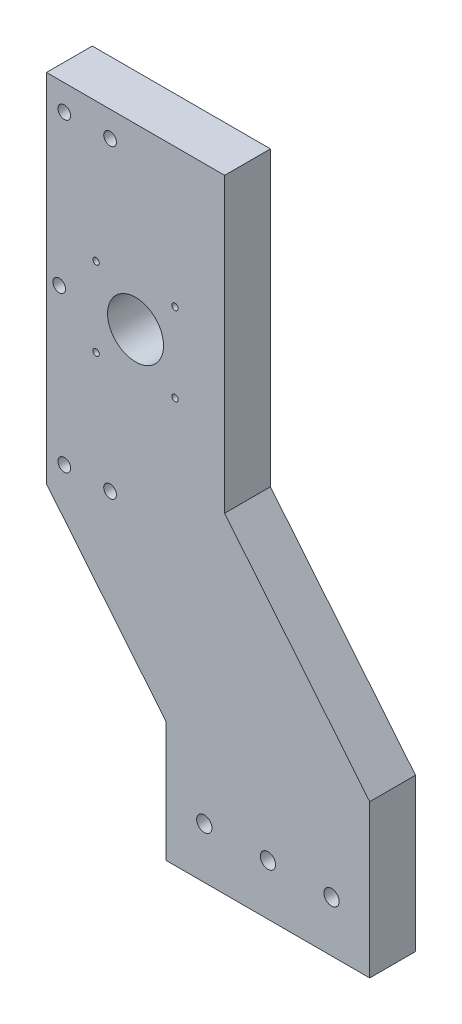
ISO-10303-21;
HEADER;
FILE_DESCRIPTION(('STEP AP214'),'2;1');
FILE_NAME('part.step','',(''),(''),'','','');
FILE_SCHEMA(('AUTOMOTIVE_DESIGN { 1 0 10303 214 1 1 1 1 }'));
ENDSEC;
DATA;
#1=APPLICATION_CONTEXT('core data for automotive mechanical design processes');
#2=APPLICATION_PROTOCOL_DEFINITION('international standard','automotive_design',2000,#1);
#3=PRODUCT_CONTEXT('',#1,'mechanical');
#4=PRODUCT('Part','Part','',(#3));
#5=PRODUCT_RELATED_PRODUCT_CATEGORY('part','',(#4));
#6=PRODUCT_DEFINITION_FORMATION('','',#4);
#7=PRODUCT_DEFINITION_CONTEXT('part definition',#1,'design');
#8=PRODUCT_DEFINITION('design','',#6,#7);
#9=PRODUCT_DEFINITION_SHAPE('','',#8);
#10=(LENGTH_UNIT() NAMED_UNIT(*) SI_UNIT(.MILLI.,.METRE.));
#11=(NAMED_UNIT(*) PLANE_ANGLE_UNIT() SI_UNIT($,.RADIAN.));
#12=(NAMED_UNIT(*) SI_UNIT($,.STERADIAN.) SOLID_ANGLE_UNIT());
#13=UNCERTAINTY_MEASURE_WITH_UNIT(LENGTH_MEASURE(1.E-05),#10,'distance_accuracy_value','');
#14=(GEOMETRIC_REPRESENTATION_CONTEXT(3) GLOBAL_UNCERTAINTY_ASSIGNED_CONTEXT((#13)) GLOBAL_UNIT_ASSIGNED_CONTEXT((#10,
#11,#12)) REPRESENTATION_CONTEXT('',''));
#15=CARTESIAN_POINT('',(0.,0.,0.));
#16=DIRECTION('',(0.,0.,1.));
#17=DIRECTION('',(1.,0.,0.));
#18=AXIS2_PLACEMENT_3D('',#15,#16,#17);
#19=CARTESIAN_POINT('',(0.,0.,18.));
#20=DIRECTION('',(-1.,0.,0.));
#21=DIRECTION('',(0.,0.,1.));
#22=AXIS2_PLACEMENT_3D('',#19,#20,#21);
#23=PLANE('',#22);
#24=DIRECTION('',(0.,1.,0.));
#25=VECTOR('',#24,1.);
#26=CARTESIAN_POINT('',(0.,0.,0.));
#27=LINE('',#26,#25);
#28=CARTESIAN_POINT('',(0.,0.,0.));
#29=VERTEX_POINT('',#28);
#30=CARTESIAN_POINT('',(0.,47.2142857142858,0.));
#31=VERTEX_POINT('',#30);
#32=EDGE_CURVE('E147',#29,#31,#27,.T.);
#33=ORIENTED_EDGE('',*,*,#32,.F.);
#34=DIRECTION('',(0.,0.,-1.));
#35=VECTOR('',#34,1.);
#36=CARTESIAN_POINT('',(0.,0.,18.));
#37=LINE('',#36,#35);
#38=CARTESIAN_POINT('',(0.,0.,18.));
#39=VERTEX_POINT('',#38);
#40=EDGE_CURVE('E11',#39,#29,#37,.T.);
#41=ORIENTED_EDGE('',*,*,#40,.F.);
#42=DIRECTION('',(0.,1.,0.));
#43=VECTOR('',#42,1.);
#44=CARTESIAN_POINT('',(0.,0.,18.));
#45=LINE('',#44,#43);
#46=CARTESIAN_POINT('',(0.,47.2142857142858,18.));
#47=VERTEX_POINT('',#46);
#48=EDGE_CURVE('E174',#39,#47,#45,.T.);
#49=ORIENTED_EDGE('',*,*,#48,.T.);
#50=DIRECTION('',(0.,0.,-1.));
#51=VECTOR('',#50,1.);
#52=CARTESIAN_POINT('',(0.,47.2142857142858,18.));
#53=LINE('',#52,#51);
#54=EDGE_CURVE('E45',#47,#31,#53,.T.);
#55=ORIENTED_EDGE('',*,*,#54,.T.);
#56=EDGE_LOOP('',(#33,#41,#49,#55));
#57=FACE_BOUND('',#56,.T.);
#58=ADVANCED_FACE('F42',(#57),#23,.T.);
#59=CARTESIAN_POINT('',(0.,0.,18.));
#60=DIRECTION('',(0.,1.,0.));
#61=DIRECTION('',(0.,0.,1.));
#62=AXIS2_PLACEMENT_3D('',#59,#60,#61);
#63=PLANE('',#62);
#64=DIRECTION('',(1.,0.,0.));
#65=VECTOR('',#64,1.);
#66=CARTESIAN_POINT('',(0.,0.,0.));
#67=LINE('',#66,#65);
#68=CARTESIAN_POINT('',(80.,0.,0.));
#69=VERTEX_POINT('',#68);
#70=EDGE_CURVE('E88',#29,#69,#67,.T.);
#71=ORIENTED_EDGE('',*,*,#70,.T.);
#72=DIRECTION('',(0.,0.,-1.));
#73=VECTOR('',#72,1.);
#74=CARTESIAN_POINT('',(80.,0.,18.));
#75=LINE('',#74,#73);
#76=CARTESIAN_POINT('',(80.,0.,18.));
#77=VERTEX_POINT('',#76);
#78=EDGE_CURVE('E52',#77,#69,#75,.T.);
#79=ORIENTED_EDGE('',*,*,#78,.F.);
#80=DIRECTION('',(1.,0.,0.));
#81=VECTOR('',#80,1.);
#82=CARTESIAN_POINT('',(0.,0.,18.));
#83=LINE('',#82,#81);
#84=EDGE_CURVE('E119',#39,#77,#83,.T.);
#85=ORIENTED_EDGE('',*,*,#84,.F.);
#86=ORIENTED_EDGE('',*,*,#40,.T.);
#87=EDGE_LOOP('',(#71,#79,#85,#86));
#88=FACE_BOUND('',#87,.T.);
#89=ADVANCED_FACE('F362',(#88),#63,.F.);
#90=CARTESIAN_POINT('',(80.,0.,18.));
#91=DIRECTION('',(-1.,0.,0.));
#92=DIRECTION('',(0.,0.,1.));
#93=AXIS2_PLACEMENT_3D('',#90,#91,#92);
#94=PLANE('',#93);
#95=DIRECTION('',(0.,1.,0.));
#96=VECTOR('',#95,1.);
#97=CARTESIAN_POINT('',(80.,0.,0.));
#98=LINE('',#97,#96);
#99=CARTESIAN_POINT('',(80.,60.,0.));
#100=VERTEX_POINT('',#99);
#101=EDGE_CURVE('E127',#69,#100,#98,.T.);
#102=ORIENTED_EDGE('',*,*,#101,.T.);
#103=DIRECTION('',(0.,0.,-1.));
#104=VECTOR('',#103,1.);
#105=CARTESIAN_POINT('',(80.,60.,18.));
#106=LINE('',#105,#104);
#107=CARTESIAN_POINT('',(80.,60.,18.));
#108=VERTEX_POINT('',#107);
#109=EDGE_CURVE('E124',#108,#100,#106,.T.);
#110=ORIENTED_EDGE('',*,*,#109,.F.);
#111=DIRECTION('',(0.,1.,0.));
#112=VECTOR('',#111,1.);
#113=CARTESIAN_POINT('',(80.,0.,18.));
#114=LINE('',#113,#112);
#115=EDGE_CURVE('E112',#77,#108,#114,.T.);
#116=ORIENTED_EDGE('',*,*,#115,.F.);
#117=ORIENTED_EDGE('',*,*,#78,.T.);
#118=EDGE_LOOP('',(#102,#110,#116,#117));
#119=FACE_BOUND('',#118,.T.);
#120=ADVANCED_FACE('F125',(#119),#94,.F.);
#121=CARTESIAN_POINT('',(80.,60.,18.));
#122=DIRECTION('',(-0.773755656108598,-0.633484162895927,0.));
#123=DIRECTION('',(0.633484162895927,-0.773755656108598,0.));
#124=AXIS2_PLACEMENT_3D('',#121,#122,#123);
#125=PLANE('',#124);
#126=DIRECTION('',(-0.633484162895927,0.773755656108598,0.));
#127=VECTOR('',#126,1.);
#128=CARTESIAN_POINT('',(80.,60.,0.));
#129=LINE('',#128,#127);
#130=CARTESIAN_POINT('',(22.9864253393666,129.638009049774,0.));
#131=VERTEX_POINT('',#130);
#132=EDGE_CURVE('E168',#100,#131,#129,.T.);
#133=ORIENTED_EDGE('',*,*,#132,.T.);
#134=DIRECTION('',(0.,0.,-1.));
#135=VECTOR('',#134,1.);
#136=CARTESIAN_POINT('',(22.9864253393666,129.638009049774,18.));
#137=LINE('',#136,#135);
#138=CARTESIAN_POINT('',(22.9864253393666,129.638009049774,18.));
#139=VERTEX_POINT('',#138);
#140=EDGE_CURVE('E131',#139,#131,#137,.T.);
#141=ORIENTED_EDGE('',*,*,#140,.F.);
#142=DIRECTION('',(-0.633484162895927,0.773755656108598,0.));
#143=VECTOR('',#142,1.);
#144=CARTESIAN_POINT('',(80.,60.,18.));
#145=LINE('',#144,#143);
#146=EDGE_CURVE('E117',#108,#139,#145,.T.);
#147=ORIENTED_EDGE('',*,*,#146,.F.);
#148=ORIENTED_EDGE('',*,*,#109,.T.);
#149=EDGE_LOOP('',(#133,#141,#147,#148));
#150=FACE_BOUND('',#149,.T.);
#151=ADVANCED_FACE('F133',(#150),#125,.F.);
#152=CARTESIAN_POINT('',(22.9864253393666,129.638009049774,18.));
#153=DIRECTION('',(-1.,0.,0.));
#154=DIRECTION('',(0.,-1.,0.));
#155=AXIS2_PLACEMENT_3D('',#152,#153,#154);
#156=PLANE('',#155);
#157=DIRECTION('',(0.,1.,0.));
#158=VECTOR('',#157,1.);
#159=CARTESIAN_POINT('',(22.9864253393666,129.638009049774,0.));
#160=LINE('',#159,#158);
#161=CARTESIAN_POINT('',(22.9864253393666,244.638009049774,0.));
#162=VERTEX_POINT('',#161);
#163=EDGE_CURVE('E164',#131,#162,#160,.T.);
#164=ORIENTED_EDGE('',*,*,#163,.T.);
#165=DIRECTION('',(0.,0.,-1.));
#166=VECTOR('',#165,1.);
#167=CARTESIAN_POINT('',(22.9864253393666,244.638009049774,18.));
#168=LINE('',#167,#166);
#169=CARTESIAN_POINT('',(22.9864253393666,244.638009049774,18.));
#170=VERTEX_POINT('',#169);
#171=EDGE_CURVE('E180',#170,#162,#168,.T.);
#172=ORIENTED_EDGE('',*,*,#171,.F.);
#173=DIRECTION('',(0.,1.,0.));
#174=VECTOR('',#173,1.);
#175=CARTESIAN_POINT('',(22.9864253393666,129.638009049774,18.));
#176=LINE('',#175,#174);
#177=EDGE_CURVE('E137',#139,#170,#176,.T.);
#178=ORIENTED_EDGE('',*,*,#177,.F.);
#179=ORIENTED_EDGE('',*,*,#140,.T.);
#180=EDGE_LOOP('',(#164,#172,#178,#179));
#181=FACE_BOUND('',#180,.T.);
#182=ADVANCED_FACE('F196',(#181),#156,.F.);
#183=CARTESIAN_POINT('',(-47.0135746606334,244.638009049774,18.));
#184=DIRECTION('',(0.,1.,0.));
#185=DIRECTION('',(0.,0.,1.));
#186=AXIS2_PLACEMENT_3D('',#183,#184,#185);
#187=PLANE('',#186);
#188=DIRECTION('',(1.,0.,0.));
#189=VECTOR('',#188,1.);
#190=CARTESIAN_POINT('',(-47.0135746606334,244.638009049774,0.));
#191=LINE('',#190,#189);
#192=CARTESIAN_POINT('',(-47.0135746606334,244.638009049774,0.));
#193=VERTEX_POINT('',#192);
#194=EDGE_CURVE('E160',#193,#162,#191,.T.);
#195=ORIENTED_EDGE('',*,*,#194,.F.);
#196=DIRECTION('',(0.,0.,-1.));
#197=VECTOR('',#196,1.);
#198=CARTESIAN_POINT('',(-47.0135746606334,244.638009049774,18.));
#199=LINE('',#198,#197);
#200=CARTESIAN_POINT('',(-47.0135746606334,244.638009049774,18.));
#201=VERTEX_POINT('',#200);
#202=EDGE_CURVE('E183',#201,#193,#199,.T.);
#203=ORIENTED_EDGE('',*,*,#202,.F.);
#204=DIRECTION('',(1.,0.,0.));
#205=VECTOR('',#204,1.);
#206=CARTESIAN_POINT('',(-47.0135746606334,244.638009049774,18.));
#207=LINE('',#206,#205);
#208=EDGE_CURVE('E141',#201,#170,#207,.T.);
#209=ORIENTED_EDGE('',*,*,#208,.T.);
#210=ORIENTED_EDGE('',*,*,#171,.T.);
#211=EDGE_LOOP('',(#195,#203,#209,#210));
#212=FACE_BOUND('',#211,.T.);
#213=ADVANCED_FACE('F376',(#212),#187,.T.);
#214=CARTESIAN_POINT('',(-47.0135746606334,104.638009049774,18.));
#215=DIRECTION('',(-1.,0.,0.));
#216=DIRECTION('',(0.,0.,1.));
#217=AXIS2_PLACEMENT_3D('',#214,#215,#216);
#218=PLANE('',#217);
#219=DIRECTION('',(0.,1.,0.));
#220=VECTOR('',#219,1.);
#221=CARTESIAN_POINT('',(-47.0135746606334,104.638009049774,0.));
#222=LINE('',#221,#220);
#223=CARTESIAN_POINT('',(-47.0135746606334,104.638009049774,0.));
#224=VERTEX_POINT('',#223);
#225=EDGE_CURVE('E156',#224,#193,#222,.T.);
#226=ORIENTED_EDGE('',*,*,#225,.F.);
#227=DIRECTION('',(0.,0.,-1.));
#228=VECTOR('',#227,1.);
#229=CARTESIAN_POINT('',(-47.0135746606334,104.638009049774,18.));
#230=LINE('',#229,#228);
#231=CARTESIAN_POINT('',(-47.0135746606334,104.638009049774,18.));
#232=VERTEX_POINT('',#231);
#233=EDGE_CURVE('E185',#232,#224,#230,.T.);
#234=ORIENTED_EDGE('',*,*,#233,.F.);
#235=DIRECTION('',(0.,1.,0.));
#236=VECTOR('',#235,1.);
#237=CARTESIAN_POINT('',(-47.0135746606334,104.638009049774,18.));
#238=LINE('',#237,#236);
#239=EDGE_CURVE('E202',#232,#201,#238,.T.);
#240=ORIENTED_EDGE('',*,*,#239,.T.);
#241=ORIENTED_EDGE('',*,*,#202,.T.);
#242=EDGE_LOOP('',(#226,#234,#240,#241));
#243=FACE_BOUND('',#242,.T.);
#244=ADVANCED_FACE('F206',(#243),#218,.T.);
#245=CARTESIAN_POINT('',(0.,47.2142857142858,18.));
#246=DIRECTION('',(-0.773755656108598,-0.633484162895927,0.));
#247=DIRECTION('',(0.633484162895927,-0.773755656108598,0.));
#248=AXIS2_PLACEMENT_3D('',#245,#246,#247);
#249=PLANE('',#248);
#250=DIRECTION('',(-0.633484162895927,0.773755656108598,0.));
#251=VECTOR('',#250,1.);
#252=CARTESIAN_POINT('',(0.,47.2142857142858,0.));
#253=LINE('',#252,#251);
#254=EDGE_CURVE('E151',#31,#224,#253,.T.);
#255=ORIENTED_EDGE('',*,*,#254,.F.);
#256=ORIENTED_EDGE('',*,*,#54,.F.);
#257=DIRECTION('',(-0.633484162895927,0.773755656108598,0.));
#258=VECTOR('',#257,1.);
#259=CARTESIAN_POINT('',(0.,47.2142857142858,18.));
#260=LINE('',#259,#258);
#261=EDGE_CURVE('E209',#47,#232,#260,.T.);
#262=ORIENTED_EDGE('',*,*,#261,.T.);
#263=ORIENTED_EDGE('',*,*,#233,.T.);
#264=EDGE_LOOP('',(#255,#256,#262,#263));
#265=FACE_BOUND('',#264,.T.);
#266=ADVANCED_FACE('F191',(#265),#249,.T.);
#267=CARTESIAN_POINT('',(0.,0.,18.));
#268=DIRECTION('',(0.,0.,-1.));
#269=DIRECTION('',(-1.,0.,0.));
#270=AXIS2_PLACEMENT_3D('',#267,#268,#269);
#271=PLANE('',#270);
#272=CARTESIAN_POINT('',(-27.5135746606309,159.138009049774,18.));
#273=DIRECTION('',(0.,0.,1.));
#274=DIRECTION('',(-1.,0.,0.));
#275=AXIS2_PLACEMENT_3D('',#272,#273,#274);
#276=CIRCLE('',#275,1.25000000001026);
#277=CARTESIAN_POINT('',(-28.7635746606412,159.138009049774,18.));
#278=VERTEX_POINT('',#277);
#279=EDGE_CURVE('E293',#278,#278,#276,.T.);
#280=ORIENTED_EDGE('',*,*,#279,.F.);
#281=EDGE_LOOP('',(#280));
#282=FACE_BOUND('',#281,.T.);
#283=CARTESIAN_POINT('',(3.48642533936859,159.138009049774,18.));
#284=DIRECTION('',(0.,0.,1.));
#285=DIRECTION('',(1.,0.,0.));
#286=AXIS2_PLACEMENT_3D('',#283,#284,#285);
#287=CIRCLE('',#286,1.25000000001026);
#288=CARTESIAN_POINT('',(4.73642533937884,159.138009049774,18.));
#289=VERTEX_POINT('',#288);
#290=EDGE_CURVE('E301',#289,#289,#287,.T.);
#291=ORIENTED_EDGE('',*,*,#290,.F.);
#292=EDGE_LOOP('',(#291));
#293=FACE_BOUND('',#292,.T.);
#294=CARTESIAN_POINT('',(3.48642533936859,190.138009049773,18.));
#295=DIRECTION('',(0.,0.,1.));
#296=DIRECTION('',(-1.,0.,0.));
#297=AXIS2_PLACEMENT_3D('',#294,#295,#296);
#298=CIRCLE('',#297,1.25000000001026);
#299=CARTESIAN_POINT('',(2.23642533935833,190.138009049773,18.));
#300=VERTEX_POINT('',#299);
#301=EDGE_CURVE('E309',#300,#300,#298,.T.);
#302=ORIENTED_EDGE('',*,*,#301,.F.);
#303=EDGE_LOOP('',(#302));
#304=FACE_BOUND('',#303,.T.);
#305=CARTESIAN_POINT('',(-27.5135746606309,190.138009049773,18.));
#306=DIRECTION('',(0.,0.,1.));
#307=DIRECTION('',(1.,0.,0.));
#308=AXIS2_PLACEMENT_3D('',#305,#306,#307);
#309=CIRCLE('',#308,1.2499999999978);
#310=CARTESIAN_POINT('',(-26.2635746606331,190.138009049773,18.));
#311=VERTEX_POINT('',#310);
#312=EDGE_CURVE('E285',#311,#311,#309,.T.);
#313=ORIENTED_EDGE('',*,*,#312,.F.);
#314=EDGE_LOOP('',(#313));
#315=FACE_BOUND('',#314,.T.);
#316=CARTESIAN_POINT('',(-12.0135746606312,174.638009049774,18.));
#317=DIRECTION('',(0.,0.,1.));
#318=DIRECTION('',(1.,0.,0.));
#319=AXIS2_PLACEMENT_3D('',#316,#317,#318);
#320=CIRCLE('',#319,11.0000000000105);
#321=CARTESIAN_POINT('',(-1.01357466062062,174.638009049774,18.));
#322=VERTEX_POINT('',#321);
#323=EDGE_CURVE('E281',#322,#322,#320,.T.);
#324=ORIENTED_EDGE('',*,*,#323,.F.);
#325=EDGE_LOOP('',(#324));
#326=FACE_BOUND('',#325,.T.);
#327=CARTESIAN_POINT('',(15.0000000000012,20.0000000000014,18.));
#328=DIRECTION('',(0.,0.,1.));
#329=DIRECTION('',(1.,0.,0.));
#330=AXIS2_PLACEMENT_3D('',#327,#328,#329);
#331=CIRCLE('',#330,3.);
#332=CARTESIAN_POINT('',(18.0000000000012,20.0000000000014,18.));
#333=VERTEX_POINT('',#332);
#334=EDGE_CURVE('E274',#333,#333,#331,.T.);
#335=ORIENTED_EDGE('',*,*,#334,.F.);
#336=EDGE_LOOP('',(#335));
#337=FACE_BOUND('',#336,.T.);
#338=CARTESIAN_POINT('',(65.0000000000012,20.000000000001,18.));
#339=DIRECTION('',(0.,0.,1.));
#340=DIRECTION('',(1.,0.,0.));
#341=AXIS2_PLACEMENT_3D('',#338,#339,#340);
#342=CIRCLE('',#341,3.00000000000001);
#343=CARTESIAN_POINT('',(68.0000000000012,20.000000000001,18.));
#344=VERTEX_POINT('',#343);
#345=EDGE_CURVE('E270',#344,#344,#342,.T.);
#346=ORIENTED_EDGE('',*,*,#345,.F.);
#347=EDGE_LOOP('',(#346));
#348=FACE_BOUND('',#347,.T.);
#349=CARTESIAN_POINT('',(40.0000000000012,20.0000000000014,18.));
#350=DIRECTION('',(0.,0.,1.));
#351=DIRECTION('',(1.,0.,0.));
#352=AXIS2_PLACEMENT_3D('',#349,#350,#351);
#353=CIRCLE('',#352,3.);
#354=CARTESIAN_POINT('',(43.0000000000012,20.0000000000014,18.));
#355=VERTEX_POINT('',#354);
#356=EDGE_CURVE('E261',#355,#355,#353,.T.);
#357=ORIENTED_EDGE('',*,*,#356,.F.);
#358=EDGE_LOOP('',(#357));
#359=FACE_BOUND('',#358,.T.);
#360=CARTESIAN_POINT('',(-40.0135746606334,114.638009049774,18.));
#361=DIRECTION('',(0.,0.,1.));
#362=DIRECTION('',(1.,0.,0.));
#363=AXIS2_PLACEMENT_3D('',#360,#361,#362);
#364=CIRCLE('',#363,2.5);
#365=CARTESIAN_POINT('',(-37.5135746606334,114.638009049774,18.));
#366=VERTEX_POINT('',#365);
#367=EDGE_CURVE('E252',#366,#366,#364,.T.);
#368=ORIENTED_EDGE('',*,*,#367,.F.);
#369=EDGE_LOOP('',(#368));
#370=FACE_BOUND('',#369,.T.);
#371=CARTESIAN_POINT('',(-22.0135746606334,114.638009049774,18.));
#372=DIRECTION('',(0.,0.,1.));
#373=DIRECTION('',(1.,0.,0.));
#374=AXIS2_PLACEMENT_3D('',#371,#372,#373);
#375=CIRCLE('',#374,2.5);
#376=CARTESIAN_POINT('',(-19.5135746606334,114.638009049774,18.));
#377=VERTEX_POINT('',#376);
#378=EDGE_CURVE('E244',#377,#377,#375,.T.);
#379=ORIENTED_EDGE('',*,*,#378,.F.);
#380=EDGE_LOOP('',(#379));
#381=FACE_BOUND('',#380,.T.);
#382=CARTESIAN_POINT('',(-40.0135746606334,234.638009049774,18.));
#383=DIRECTION('',(0.,0.,1.));
#384=DIRECTION('',(1.,0.,0.));
#385=AXIS2_PLACEMENT_3D('',#382,#383,#384);
#386=CIRCLE('',#385,2.5);
#387=CARTESIAN_POINT('',(-37.5135746606334,234.638009049774,18.));
#388=VERTEX_POINT('',#387);
#389=EDGE_CURVE('E236',#388,#388,#386,.T.);
#390=ORIENTED_EDGE('',*,*,#389,.F.);
#391=EDGE_LOOP('',(#390));
#392=FACE_BOUND('',#391,.T.);
#393=CARTESIAN_POINT('',(-22.0135746606334,234.638009049774,18.));
#394=DIRECTION('',(0.,0.,1.));
#395=DIRECTION('',(1.,0.,0.));
#396=AXIS2_PLACEMENT_3D('',#393,#394,#395);
#397=CIRCLE('',#396,2.5);
#398=CARTESIAN_POINT('',(-19.5135746606334,234.638009049774,18.));
#399=VERTEX_POINT('',#398);
#400=EDGE_CURVE('E228',#399,#399,#397,.T.);
#401=ORIENTED_EDGE('',*,*,#400,.F.);
#402=EDGE_LOOP('',(#401));
#403=FACE_BOUND('',#402,.T.);
#404=CARTESIAN_POINT('',(-42.0135746606334,174.638009049774,18.));
#405=DIRECTION('',(0.,0.,1.));
#406=DIRECTION('',(1.,0.,0.));
#407=AXIS2_PLACEMENT_3D('',#404,#405,#406);
#408=CIRCLE('',#407,2.5);
#409=CARTESIAN_POINT('',(-39.5135746606334,174.638009049774,18.));
#410=VERTEX_POINT('',#409);
#411=EDGE_CURVE('E220',#410,#410,#408,.T.);
#412=ORIENTED_EDGE('',*,*,#411,.F.);
#413=EDGE_LOOP('',(#412));
#414=FACE_BOUND('',#413,.T.);
#415=ORIENTED_EDGE('',*,*,#48,.F.);
#416=ORIENTED_EDGE('',*,*,#84,.T.);
#417=ORIENTED_EDGE('',*,*,#115,.T.);
#418=ORIENTED_EDGE('',*,*,#146,.T.);
#419=ORIENTED_EDGE('',*,*,#177,.T.);
#420=ORIENTED_EDGE('',*,*,#208,.F.);
#421=ORIENTED_EDGE('',*,*,#239,.F.);
#422=ORIENTED_EDGE('',*,*,#261,.F.);
#423=EDGE_LOOP('',(#415,#416,#417,#418,#419,#420,#421,#422));
#424=FACE_BOUND('',#423,.T.);
#425=ADVANCED_FACE('F115',(#282,#293,#304,#315,#326,#337,#348,#359,#370,#381,#392,#403,#414,
#424),#271,.F.);
#426=CARTESIAN_POINT('',(0.,0.,0.));
#427=DIRECTION('',(0.,0.,-1.));
#428=DIRECTION('',(-1.,0.,0.));
#429=AXIS2_PLACEMENT_3D('',#426,#427,#428);
#430=PLANE('',#429);
#431=CARTESIAN_POINT('',(-27.5135746606309,159.138009049774,0.));
#432=DIRECTION('',(0.,0.,1.));
#433=DIRECTION('',(-1.,0.,0.));
#434=AXIS2_PLACEMENT_3D('',#431,#432,#433);
#435=CIRCLE('',#434,1.25000000001026);
#436=CARTESIAN_POINT('',(-28.7635746606412,159.138009049774,0.));
#437=VERTEX_POINT('',#436);
#438=EDGE_CURVE('E289',#437,#437,#435,.T.);
#439=ORIENTED_EDGE('',*,*,#438,.T.);
#440=EDGE_LOOP('',(#439));
#441=FACE_BOUND('',#440,.T.);
#442=CARTESIAN_POINT('',(3.48642533936859,159.138009049774,0.));
#443=DIRECTION('',(0.,0.,1.));
#444=DIRECTION('',(1.,0.,0.));
#445=AXIS2_PLACEMENT_3D('',#442,#443,#444);
#446=CIRCLE('',#445,1.25000000001026);
#447=CARTESIAN_POINT('',(4.73642533937884,159.138009049774,0.));
#448=VERTEX_POINT('',#447);
#449=EDGE_CURVE('E297',#448,#448,#446,.T.);
#450=ORIENTED_EDGE('',*,*,#449,.T.);
#451=EDGE_LOOP('',(#450));
#452=FACE_BOUND('',#451,.T.);
#453=CARTESIAN_POINT('',(3.48642533936859,190.138009049773,0.));
#454=DIRECTION('',(0.,0.,1.));
#455=DIRECTION('',(-1.,0.,0.));
#456=AXIS2_PLACEMENT_3D('',#453,#454,#455);
#457=CIRCLE('',#456,1.25000000001026);
#458=CARTESIAN_POINT('',(2.23642533935833,190.138009049773,0.));
#459=VERTEX_POINT('',#458);
#460=EDGE_CURVE('E305',#459,#459,#457,.T.);
#461=ORIENTED_EDGE('',*,*,#460,.T.);
#462=EDGE_LOOP('',(#461));
#463=FACE_BOUND('',#462,.T.);
#464=CARTESIAN_POINT('',(-27.5135746606309,190.138009049773,0.));
#465=DIRECTION('',(0.,0.,1.));
#466=DIRECTION('',(1.,0.,0.));
#467=AXIS2_PLACEMENT_3D('',#464,#465,#466);
#468=CIRCLE('',#467,1.2499999999978);
#469=CARTESIAN_POINT('',(-26.2635746606331,190.138009049773,0.));
#470=VERTEX_POINT('',#469);
#471=EDGE_CURVE('E313',#470,#470,#468,.T.);
#472=ORIENTED_EDGE('',*,*,#471,.T.);
#473=EDGE_LOOP('',(#472));
#474=FACE_BOUND('',#473,.T.);
#475=CARTESIAN_POINT('',(-12.0135746606312,174.638009049774,0.));
#476=DIRECTION('',(0.,0.,1.));
#477=DIRECTION('',(1.,0.,0.));
#478=AXIS2_PLACEMENT_3D('',#475,#476,#477);
#479=CIRCLE('',#478,11.0000000000105);
#480=CARTESIAN_POINT('',(-1.01357466062062,174.638009049774,0.));
#481=VERTEX_POINT('',#480);
#482=EDGE_CURVE('E262',#481,#481,#479,.T.);
#483=ORIENTED_EDGE('',*,*,#482,.T.);
#484=EDGE_LOOP('',(#483));
#485=FACE_BOUND('',#484,.T.);
#486=CARTESIAN_POINT('',(15.0000000000012,20.0000000000014,0.));
#487=DIRECTION('',(0.,0.,1.));
#488=DIRECTION('',(1.,0.,0.));
#489=AXIS2_PLACEMENT_3D('',#486,#487,#488);
#490=CIRCLE('',#489,3.);
#491=CARTESIAN_POINT('',(18.0000000000012,20.0000000000014,0.));
#492=VERTEX_POINT('',#491);
#493=EDGE_CURVE('E256',#492,#492,#490,.T.);
#494=ORIENTED_EDGE('',*,*,#493,.T.);
#495=EDGE_LOOP('',(#494));
#496=FACE_BOUND('',#495,.T.);
#497=CARTESIAN_POINT('',(65.0000000000012,20.000000000001,0.));
#498=DIRECTION('',(0.,0.,1.));
#499=DIRECTION('',(1.,0.,0.));
#500=AXIS2_PLACEMENT_3D('',#497,#498,#499);
#501=CIRCLE('',#500,3.00000000000001);
#502=CARTESIAN_POINT('',(68.0000000000012,20.000000000001,0.));
#503=VERTEX_POINT('',#502);
#504=EDGE_CURVE('E266',#503,#503,#501,.T.);
#505=ORIENTED_EDGE('',*,*,#504,.T.);
#506=EDGE_LOOP('',(#505));
#507=FACE_BOUND('',#506,.T.);
#508=CARTESIAN_POINT('',(40.0000000000012,20.0000000000014,0.));
#509=DIRECTION('',(0.,0.,1.));
#510=DIRECTION('',(1.,0.,0.));
#511=AXIS2_PLACEMENT_3D('',#508,#509,#510);
#512=CIRCLE('',#511,3.);
#513=CARTESIAN_POINT('',(43.0000000000012,20.0000000000014,0.));
#514=VERTEX_POINT('',#513);
#515=EDGE_CURVE('E257',#514,#514,#512,.T.);
#516=ORIENTED_EDGE('',*,*,#515,.T.);
#517=EDGE_LOOP('',(#516));
#518=FACE_BOUND('',#517,.T.);
#519=CARTESIAN_POINT('',(-40.0135746606334,114.638009049774,0.));
#520=DIRECTION('',(0.,0.,1.));
#521=DIRECTION('',(1.,0.,0.));
#522=AXIS2_PLACEMENT_3D('',#519,#520,#521);
#523=CIRCLE('',#522,2.5);
#524=CARTESIAN_POINT('',(-37.5135746606334,114.638009049774,0.));
#525=VERTEX_POINT('',#524);
#526=EDGE_CURVE('E248',#525,#525,#523,.T.);
#527=ORIENTED_EDGE('',*,*,#526,.T.);
#528=EDGE_LOOP('',(#527));
#529=FACE_BOUND('',#528,.T.);
#530=CARTESIAN_POINT('',(-22.0135746606334,114.638009049774,0.));
#531=DIRECTION('',(0.,0.,1.));
#532=DIRECTION('',(1.,0.,0.));
#533=AXIS2_PLACEMENT_3D('',#530,#531,#532);
#534=CIRCLE('',#533,2.5);
#535=CARTESIAN_POINT('',(-19.5135746606334,114.638009049774,0.));
#536=VERTEX_POINT('',#535);
#537=EDGE_CURVE('E240',#536,#536,#534,.T.);
#538=ORIENTED_EDGE('',*,*,#537,.T.);
#539=EDGE_LOOP('',(#538));
#540=FACE_BOUND('',#539,.T.);
#541=CARTESIAN_POINT('',(-40.0135746606334,234.638009049774,0.));
#542=DIRECTION('',(0.,0.,1.));
#543=DIRECTION('',(1.,0.,0.));
#544=AXIS2_PLACEMENT_3D('',#541,#542,#543);
#545=CIRCLE('',#544,2.5);
#546=CARTESIAN_POINT('',(-37.5135746606334,234.638009049774,0.));
#547=VERTEX_POINT('',#546);
#548=EDGE_CURVE('E232',#547,#547,#545,.T.);
#549=ORIENTED_EDGE('',*,*,#548,.T.);
#550=EDGE_LOOP('',(#549));
#551=FACE_BOUND('',#550,.T.);
#552=CARTESIAN_POINT('',(-22.0135746606334,234.638009049774,0.));
#553=DIRECTION('',(0.,0.,1.));
#554=DIRECTION('',(1.,0.,0.));
#555=AXIS2_PLACEMENT_3D('',#552,#553,#554);
#556=CIRCLE('',#555,2.5);
#557=CARTESIAN_POINT('',(-19.5135746606334,234.638009049774,0.));
#558=VERTEX_POINT('',#557);
#559=EDGE_CURVE('E224',#558,#558,#556,.T.);
#560=ORIENTED_EDGE('',*,*,#559,.T.);
#561=EDGE_LOOP('',(#560));
#562=FACE_BOUND('',#561,.T.);
#563=CARTESIAN_POINT('',(-42.0135746606334,174.638009049774,0.));
#564=DIRECTION('',(0.,0.,1.));
#565=DIRECTION('',(1.,0.,0.));
#566=AXIS2_PLACEMENT_3D('',#563,#564,#565);
#567=CIRCLE('',#566,2.5);
#568=CARTESIAN_POINT('',(-39.5135746606334,174.638009049774,0.));
#569=VERTEX_POINT('',#568);
#570=EDGE_CURVE('E152',#569,#569,#567,.T.);
#571=ORIENTED_EDGE('',*,*,#570,.T.);
#572=EDGE_LOOP('',(#571));
#573=FACE_BOUND('',#572,.T.);
#574=ORIENTED_EDGE('',*,*,#32,.T.);
#575=ORIENTED_EDGE('',*,*,#254,.T.);
#576=ORIENTED_EDGE('',*,*,#225,.T.);
#577=ORIENTED_EDGE('',*,*,#194,.T.);
#578=ORIENTED_EDGE('',*,*,#163,.F.);
#579=ORIENTED_EDGE('',*,*,#132,.F.);
#580=ORIENTED_EDGE('',*,*,#101,.F.);
#581=ORIENTED_EDGE('',*,*,#70,.F.);
#582=EDGE_LOOP('',(#574,#575,#576,#577,#578,#579,#580,#581));
#583=FACE_BOUND('',#582,.T.);
#584=ADVANCED_FACE('F193',(#441,#452,#463,#474,#485,#496,#507,#518,#529,#540,#551,#562,#573,
#583),#430,.T.);
#585=CARTESIAN_POINT('',(-42.0135746606334,174.638009049774,18.));
#586=DIRECTION('',(0.,0.,1.));
#587=DIRECTION('',(1.,0.,0.));
#588=AXIS2_PLACEMENT_3D('',#585,#586,#587);
#589=CYLINDRICAL_SURFACE('',#588,2.5);
#590=ORIENTED_EDGE('',*,*,#570,.F.);
#591=EDGE_LOOP('',(#590));
#592=FACE_BOUND('',#591,.T.);
#593=ORIENTED_EDGE('',*,*,#411,.T.);
#594=EDGE_LOOP('',(#593));
#595=FACE_BOUND('',#594,.T.);
#596=ADVANCED_FACE('F346',(#592,#595),#589,.F.);
#597=CARTESIAN_POINT('',(-22.0135746606334,234.638009049774,18.));
#598=DIRECTION('',(0.,0.,1.));
#599=DIRECTION('',(1.,0.,0.));
#600=AXIS2_PLACEMENT_3D('',#597,#598,#599);
#601=CYLINDRICAL_SURFACE('',#600,2.5);
#602=ORIENTED_EDGE('',*,*,#559,.F.);
#603=EDGE_LOOP('',(#602));
#604=FACE_BOUND('',#603,.T.);
#605=ORIENTED_EDGE('',*,*,#400,.T.);
#606=EDGE_LOOP('',(#605));
#607=FACE_BOUND('',#606,.T.);
#608=ADVANCED_FACE('F348',(#604,#607),#601,.F.);
#609=CARTESIAN_POINT('',(-40.0135746606334,234.638009049774,18.));
#610=DIRECTION('',(0.,0.,1.));
#611=DIRECTION('',(1.,0.,0.));
#612=AXIS2_PLACEMENT_3D('',#609,#610,#611);
#613=CYLINDRICAL_SURFACE('',#612,2.5);
#614=ORIENTED_EDGE('',*,*,#548,.F.);
#615=EDGE_LOOP('',(#614));
#616=FACE_BOUND('',#615,.T.);
#617=ORIENTED_EDGE('',*,*,#389,.T.);
#618=EDGE_LOOP('',(#617));
#619=FACE_BOUND('',#618,.T.);
#620=ADVANCED_FACE('F355',(#616,#619),#613,.F.);
#621=CARTESIAN_POINT('',(-22.0135746606334,114.638009049774,18.));
#622=DIRECTION('',(0.,0.,1.));
#623=DIRECTION('',(1.,0.,0.));
#624=AXIS2_PLACEMENT_3D('',#621,#622,#623);
#625=CYLINDRICAL_SURFACE('',#624,2.5);
#626=ORIENTED_EDGE('',*,*,#537,.F.);
#627=EDGE_LOOP('',(#626));
#628=FACE_BOUND('',#627,.T.);
#629=ORIENTED_EDGE('',*,*,#378,.T.);
#630=EDGE_LOOP('',(#629));
#631=FACE_BOUND('',#630,.T.);
#632=ADVANCED_FACE('F495',(#628,#631),#625,.F.);
#633=CARTESIAN_POINT('',(-40.0135746606334,114.638009049774,18.));
#634=DIRECTION('',(0.,0.,1.));
#635=DIRECTION('',(1.,0.,0.));
#636=AXIS2_PLACEMENT_3D('',#633,#634,#635);
#637=CYLINDRICAL_SURFACE('',#636,2.5);
#638=ORIENTED_EDGE('',*,*,#526,.F.);
#639=EDGE_LOOP('',(#638));
#640=FACE_BOUND('',#639,.T.);
#641=ORIENTED_EDGE('',*,*,#367,.T.);
#642=EDGE_LOOP('',(#641));
#643=FACE_BOUND('',#642,.T.);
#644=ADVANCED_FACE('F485',(#640,#643),#637,.F.);
#645=CARTESIAN_POINT('',(40.0000000000012,20.0000000000014,0.));
#646=DIRECTION('',(0.,0.,1.));
#647=DIRECTION('',(1.,0.,0.));
#648=AXIS2_PLACEMENT_3D('',#645,#646,#647);
#649=CYLINDRICAL_SURFACE('',#648,3.);
#650=ORIENTED_EDGE('',*,*,#515,.F.);
#651=EDGE_LOOP('',(#650));
#652=FACE_BOUND('',#651,.T.);
#653=ORIENTED_EDGE('',*,*,#356,.T.);
#654=EDGE_LOOP('',(#653));
#655=FACE_BOUND('',#654,.T.);
#656=ADVANCED_FACE('F475',(#652,#655),#649,.F.);
#657=CARTESIAN_POINT('',(65.0000000000012,20.000000000001,0.));
#658=DIRECTION('',(0.,0.,1.));
#659=DIRECTION('',(1.,0.,0.));
#660=AXIS2_PLACEMENT_3D('',#657,#658,#659);
#661=CYLINDRICAL_SURFACE('',#660,3.00000000000001);
#662=ORIENTED_EDGE('',*,*,#504,.F.);
#663=EDGE_LOOP('',(#662));
#664=FACE_BOUND('',#663,.T.);
#665=ORIENTED_EDGE('',*,*,#345,.T.);
#666=EDGE_LOOP('',(#665));
#667=FACE_BOUND('',#666,.T.);
#668=ADVANCED_FACE('F466',(#664,#667),#661,.F.);
#669=CARTESIAN_POINT('',(15.0000000000012,20.0000000000014,0.));
#670=DIRECTION('',(0.,0.,1.));
#671=DIRECTION('',(1.,0.,0.));
#672=AXIS2_PLACEMENT_3D('',#669,#670,#671);
#673=CYLINDRICAL_SURFACE('',#672,3.);
#674=ORIENTED_EDGE('',*,*,#493,.F.);
#675=EDGE_LOOP('',(#674));
#676=FACE_BOUND('',#675,.T.);
#677=ORIENTED_EDGE('',*,*,#334,.T.);
#678=EDGE_LOOP('',(#677));
#679=FACE_BOUND('',#678,.T.);
#680=ADVANCED_FACE('F407',(#676,#679),#673,.F.);
#681=CARTESIAN_POINT('',(-12.0135746606312,174.638009049774,0.));
#682=DIRECTION('',(0.,0.,1.));
#683=DIRECTION('',(1.,0.,0.));
#684=AXIS2_PLACEMENT_3D('',#681,#682,#683);
#685=CYLINDRICAL_SURFACE('',#684,11.0000000000105);
#686=ORIENTED_EDGE('',*,*,#482,.F.);
#687=EDGE_LOOP('',(#686));
#688=FACE_BOUND('',#687,.T.);
#689=ORIENTED_EDGE('',*,*,#323,.T.);
#690=EDGE_LOOP('',(#689));
#691=FACE_BOUND('',#690,.T.);
#692=ADVANCED_FACE('F402',(#688,#691),#685,.F.);
#693=CARTESIAN_POINT('',(-27.5135746606309,190.138009049773,0.));
#694=DIRECTION('',(0.,0.,1.));
#695=DIRECTION('',(1.,0.,0.));
#696=AXIS2_PLACEMENT_3D('',#693,#694,#695);
#697=CYLINDRICAL_SURFACE('',#696,1.2499999999978);
#698=ORIENTED_EDGE('',*,*,#471,.F.);
#699=EDGE_LOOP('',(#698));
#700=FACE_BOUND('',#699,.T.);
#701=ORIENTED_EDGE('',*,*,#312,.T.);
#702=EDGE_LOOP('',(#701));
#703=FACE_BOUND('',#702,.T.);
#704=ADVANCED_FACE('F322',(#700,#703),#697,.F.);
#705=CARTESIAN_POINT('',(3.48642533936859,190.138009049773,0.));
#706=DIRECTION('',(0.,0.,1.));
#707=DIRECTION('',(1.,0.,0.));
#708=AXIS2_PLACEMENT_3D('',#705,#706,#707);
#709=CYLINDRICAL_SURFACE('',#708,1.25000000001026);
#710=ORIENTED_EDGE('',*,*,#460,.F.);
#711=EDGE_LOOP('',(#710));
#712=FACE_BOUND('',#711,.T.);
#713=ORIENTED_EDGE('',*,*,#301,.T.);
#714=EDGE_LOOP('',(#713));
#715=FACE_BOUND('',#714,.T.);
#716=ADVANCED_FACE('F420',(#712,#715),#709,.F.);
#717=CARTESIAN_POINT('',(3.48642533936859,159.138009049774,0.));
#718=DIRECTION('',(0.,0.,1.));
#719=DIRECTION('',(1.,0.,0.));
#720=AXIS2_PLACEMENT_3D('',#717,#718,#719);
#721=CYLINDRICAL_SURFACE('',#720,1.25000000001026);
#722=ORIENTED_EDGE('',*,*,#449,.F.);
#723=EDGE_LOOP('',(#722));
#724=FACE_BOUND('',#723,.T.);
#725=ORIENTED_EDGE('',*,*,#290,.T.);
#726=EDGE_LOOP('',(#725));
#727=FACE_BOUND('',#726,.T.);
#728=ADVANCED_FACE('F431',(#724,#727),#721,.F.);
#729=CARTESIAN_POINT('',(-27.5135746606309,159.138009049774,0.));
#730=DIRECTION('',(0.,0.,1.));
#731=DIRECTION('',(1.,0.,0.));
#732=AXIS2_PLACEMENT_3D('',#729,#730,#731);
#733=CYLINDRICAL_SURFACE('',#732,1.25000000001026);
#734=ORIENTED_EDGE('',*,*,#438,.F.);
#735=EDGE_LOOP('',(#734));
#736=FACE_BOUND('',#735,.T.);
#737=ORIENTED_EDGE('',*,*,#279,.T.);
#738=EDGE_LOOP('',(#737));
#739=FACE_BOUND('',#738,.T.);
#740=ADVANCED_FACE('F442',(#736,#739),#733,.F.);
#741=CLOSED_SHELL('',(#58,#89,#120,#151,#182,#213,#244,#266,#425,#584,#596,#608,#620,#632,#644,
#656,#668,#680,#692,#704,#716,#728,#740));
#742=MANIFOLD_SOLID_BREP('B2',#741);
#743=ADVANCED_BREP_SHAPE_REPRESENTATION('',(#18,#742),#14);
#744=SHAPE_DEFINITION_REPRESENTATION(#9,#743);
ENDSEC;
END-ISO-10303-21;
